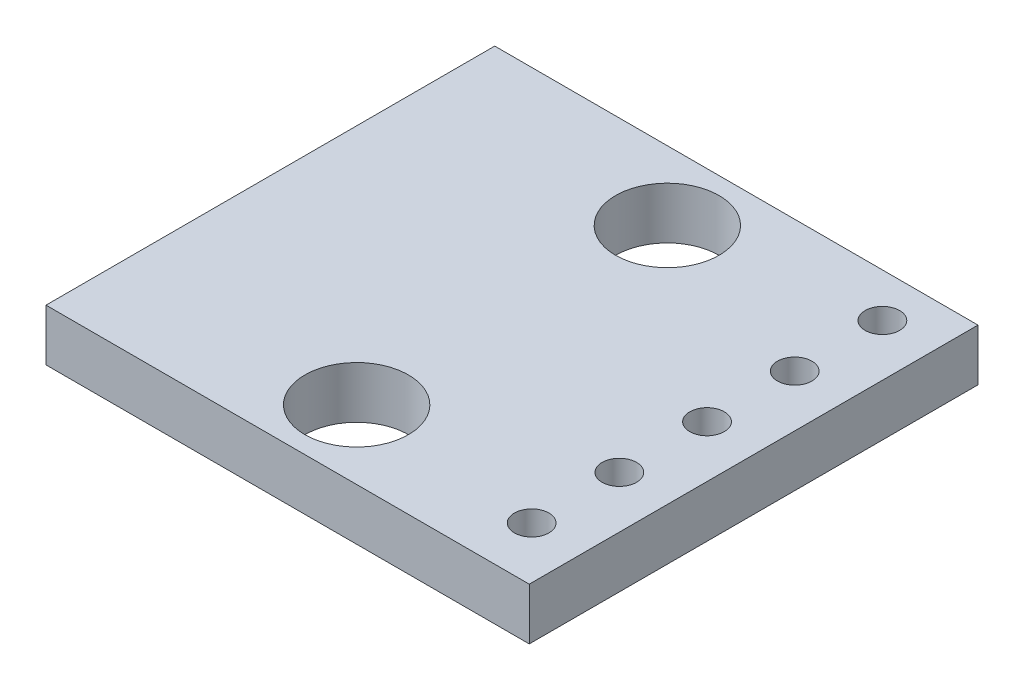
ISO-10303-21;
HEADER;
FILE_DESCRIPTION(('STEP AP214'),'2;1');
FILE_NAME('part.step','',(''),(''),'','','');
FILE_SCHEMA(('AUTOMOTIVE_DESIGN { 1 0 10303 214 1 1 1 1 }'));
ENDSEC;
DATA;
#1=APPLICATION_CONTEXT('core data for automotive mechanical design processes');
#2=APPLICATION_PROTOCOL_DEFINITION('international standard','automotive_design',2000,#1);
#3=PRODUCT_CONTEXT('',#1,'mechanical');
#4=PRODUCT('Part','Part','',(#3));
#5=PRODUCT_RELATED_PRODUCT_CATEGORY('part','',(#4));
#6=PRODUCT_DEFINITION_FORMATION('','',#4);
#7=PRODUCT_DEFINITION_CONTEXT('part definition',#1,'design');
#8=PRODUCT_DEFINITION('design','',#6,#7);
#9=PRODUCT_DEFINITION_SHAPE('','',#8);
#10=(LENGTH_UNIT() NAMED_UNIT(*) SI_UNIT(.MILLI.,.METRE.));
#11=(NAMED_UNIT(*) PLANE_ANGLE_UNIT() SI_UNIT($,.RADIAN.));
#12=(NAMED_UNIT(*) SI_UNIT($,.STERADIAN.) SOLID_ANGLE_UNIT());
#13=UNCERTAINTY_MEASURE_WITH_UNIT(LENGTH_MEASURE(1.E-05),#10,'distance_accuracy_value','');
#14=(GEOMETRIC_REPRESENTATION_CONTEXT(3) GLOBAL_UNCERTAINTY_ASSIGNED_CONTEXT((#13)) GLOBAL_UNIT_ASSIGNED_CONTEXT((#10,
#11,#12)) REPRESENTATION_CONTEXT('',''));
#15=CARTESIAN_POINT('',(0.,0.,0.));
#16=DIRECTION('',(0.,0.,1.));
#17=DIRECTION('',(1.,0.,0.));
#18=AXIS2_PLACEMENT_3D('',#15,#16,#17);
#19=CARTESIAN_POINT('',(7.,1.5,6.5));
#20=DIRECTION('',(-1.,0.,0.));
#21=DIRECTION('',(0.,0.,1.));
#22=AXIS2_PLACEMENT_3D('',#19,#20,#21);
#23=PLANE('',#22);
#24=DIRECTION('',(0.,0.,-1.));
#25=VECTOR('',#24,1.);
#26=CARTESIAN_POINT('',(7.,0.,6.5));
#27=LINE('',#26,#25);
#28=CARTESIAN_POINT('',(7.,0.,6.5));
#29=VERTEX_POINT('',#28);
#30=CARTESIAN_POINT('',(7.,0.,-6.5));
#31=VERTEX_POINT('',#30);
#32=EDGE_CURVE('E96',#29,#31,#27,.T.);
#33=ORIENTED_EDGE('',*,*,#32,.T.);
#34=DIRECTION('',(0.,-1.,0.));
#35=VECTOR('',#34,1.);
#36=CARTESIAN_POINT('',(7.,1.5,-6.5));
#37=LINE('',#36,#35);
#38=CARTESIAN_POINT('',(7.,1.5,-6.5));
#39=VERTEX_POINT('',#38);
#40=EDGE_CURVE('E11',#39,#31,#37,.T.);
#41=ORIENTED_EDGE('',*,*,#40,.F.);
#42=DIRECTION('',(0.,0.,-1.));
#43=VECTOR('',#42,1.);
#44=CARTESIAN_POINT('',(7.,1.5,6.5));
#45=LINE('',#44,#43);
#46=CARTESIAN_POINT('',(7.,1.5,6.5));
#47=VERTEX_POINT('',#46);
#48=EDGE_CURVE('E84',#47,#39,#45,.T.);
#49=ORIENTED_EDGE('',*,*,#48,.F.);
#50=DIRECTION('',(0.,-1.,0.));
#51=VECTOR('',#50,1.);
#52=CARTESIAN_POINT('',(7.,1.5,6.5));
#53=LINE('',#52,#51);
#54=EDGE_CURVE('E92',#47,#29,#53,.T.);
#55=ORIENTED_EDGE('',*,*,#54,.T.);
#56=EDGE_LOOP('',(#33,#41,#49,#55));
#57=FACE_BOUND('',#56,.T.);
#58=ADVANCED_FACE('F33',(#57),#23,.F.);
#59=CARTESIAN_POINT('',(-7.,1.5,-6.5));
#60=DIRECTION('',(0.,0.,1.));
#61=DIRECTION('',(1.,0.,0.));
#62=AXIS2_PLACEMENT_3D('',#59,#60,#61);
#63=PLANE('',#62);
#64=DIRECTION('',(-1.,0.,0.));
#65=VECTOR('',#64,1.);
#66=CARTESIAN_POINT('',(-7.,0.,-6.5));
#67=LINE('',#66,#65);
#68=CARTESIAN_POINT('',(-7.,0.,-6.5));
#69=VERTEX_POINT('',#68);
#70=EDGE_CURVE('E88',#31,#69,#67,.T.);
#71=ORIENTED_EDGE('',*,*,#70,.T.);
#72=DIRECTION('',(0.,-1.,0.));
#73=VECTOR('',#72,1.);
#74=CARTESIAN_POINT('',(-7.,1.5,-6.5));
#75=LINE('',#74,#73);
#76=CARTESIAN_POINT('',(-7.,1.5,-6.5));
#77=VERTEX_POINT('',#76);
#78=EDGE_CURVE('E41',#77,#69,#75,.T.);
#79=ORIENTED_EDGE('',*,*,#78,.F.);
#80=DIRECTION('',(-1.,0.,0.));
#81=VECTOR('',#80,1.);
#82=CARTESIAN_POINT('',(-7.,1.5,-6.5));
#83=LINE('',#82,#81);
#84=EDGE_CURVE('E79',#39,#77,#83,.T.);
#85=ORIENTED_EDGE('',*,*,#84,.F.);
#86=ORIENTED_EDGE('',*,*,#40,.T.);
#87=EDGE_LOOP('',(#71,#79,#85,#86));
#88=FACE_BOUND('',#87,.T.);
#89=ADVANCED_FACE('F87',(#88),#63,.F.);
#90=CARTESIAN_POINT('',(-7.,1.5,6.5));
#91=DIRECTION('',(1.,0.,0.));
#92=DIRECTION('',(0.,0.,-1.));
#93=AXIS2_PLACEMENT_3D('',#90,#91,#92);
#94=PLANE('',#93);
#95=DIRECTION('',(0.,0.,1.));
#96=VECTOR('',#95,1.);
#97=CARTESIAN_POINT('',(-7.,0.,6.5));
#98=LINE('',#97,#96);
#99=CARTESIAN_POINT('',(-7.,0.,6.5));
#100=VERTEX_POINT('',#99);
#101=EDGE_CURVE('E66',#69,#100,#98,.T.);
#102=ORIENTED_EDGE('',*,*,#101,.T.);
#103=DIRECTION('',(0.,-1.,0.));
#104=VECTOR('',#103,1.);
#105=CARTESIAN_POINT('',(-7.,1.5,6.5));
#106=LINE('',#105,#104);
#107=CARTESIAN_POINT('',(-7.,1.5,6.5));
#108=VERTEX_POINT('',#107);
#109=EDGE_CURVE('E89',#108,#100,#106,.T.);
#110=ORIENTED_EDGE('',*,*,#109,.F.);
#111=DIRECTION('',(0.,0.,1.));
#112=VECTOR('',#111,1.);
#113=CARTESIAN_POINT('',(-7.,1.5,6.5));
#114=LINE('',#113,#112);
#115=EDGE_CURVE('E82',#77,#108,#114,.T.);
#116=ORIENTED_EDGE('',*,*,#115,.F.);
#117=ORIENTED_EDGE('',*,*,#78,.T.);
#118=EDGE_LOOP('',(#102,#110,#116,#117));
#119=FACE_BOUND('',#118,.T.);
#120=ADVANCED_FACE('F90',(#119),#94,.F.);
#121=CARTESIAN_POINT('',(-7.,1.5,6.5));
#122=DIRECTION('',(0.,0.,-1.));
#123=DIRECTION('',(-1.,0.,0.));
#124=AXIS2_PLACEMENT_3D('',#121,#122,#123);
#125=PLANE('',#124);
#126=DIRECTION('',(1.,0.,0.));
#127=VECTOR('',#126,1.);
#128=CARTESIAN_POINT('',(-7.,0.,6.5));
#129=LINE('',#128,#127);
#130=EDGE_CURVE('E72',#100,#29,#129,.T.);
#131=ORIENTED_EDGE('',*,*,#130,.T.);
#132=ORIENTED_EDGE('',*,*,#54,.F.);
#133=DIRECTION('',(1.,0.,0.));
#134=VECTOR('',#133,1.);
#135=CARTESIAN_POINT('',(-7.,1.5,6.5));
#136=LINE('',#135,#134);
#137=EDGE_CURVE('E49',#108,#47,#136,.T.);
#138=ORIENTED_EDGE('',*,*,#137,.F.);
#139=ORIENTED_EDGE('',*,*,#109,.T.);
#140=EDGE_LOOP('',(#131,#132,#138,#139));
#141=FACE_BOUND('',#140,.T.);
#142=ADVANCED_FACE('F104',(#141),#125,.F.);
#143=CARTESIAN_POINT('',(0.,1.5,0.));
#144=DIRECTION('',(0.,-1.,0.));
#145=DIRECTION('',(0.,0.,-1.));
#146=AXIS2_PLACEMENT_3D('',#143,#144,#145);
#147=PLANE('',#146);
#148=CARTESIAN_POINT('',(5.49999999999997,1.5,-5.22999999999957));
#149=DIRECTION('',(0.,1.,0.));
#150=DIRECTION('',(0.,0.,1.));
#151=AXIS2_PLACEMENT_3D('',#148,#149,#150);
#152=CIRCLE('',#151,0.5);
#153=CARTESIAN_POINT('',(5.49999999999997,1.5,-4.72999999999957));
#154=VERTEX_POINT('',#153);
#155=EDGE_CURVE('E116',#154,#154,#152,.T.);
#156=ORIENTED_EDGE('',*,*,#155,.F.);
#157=EDGE_LOOP('',(#156));
#158=FACE_BOUND('',#157,.T.);
#159=CARTESIAN_POINT('',(5.49999999999997,1.5,-2.68999999999968));
#160=DIRECTION('',(0.,1.,0.));
#161=DIRECTION('',(0.,0.,1.));
#162=AXIS2_PLACEMENT_3D('',#159,#160,#161);
#163=CIRCLE('',#162,0.5);
#164=CARTESIAN_POINT('',(5.49999999999997,1.5,-2.18999999999968));
#165=VERTEX_POINT('',#164);
#166=EDGE_CURVE('E122',#165,#165,#163,.T.);
#167=ORIENTED_EDGE('',*,*,#166,.F.);
#168=EDGE_LOOP('',(#167));
#169=FACE_BOUND('',#168,.T.);
#170=CARTESIAN_POINT('',(5.49999999999998,1.5,-0.149999999999787));
#171=DIRECTION('',(0.,1.,0.));
#172=DIRECTION('',(0.,0.,1.));
#173=AXIS2_PLACEMENT_3D('',#170,#171,#172);
#174=CIRCLE('',#173,0.5);
#175=CARTESIAN_POINT('',(5.49999999999998,1.5,0.350000000000213));
#176=VERTEX_POINT('',#175);
#177=EDGE_CURVE('E128',#176,#176,#174,.T.);
#178=ORIENTED_EDGE('',*,*,#177,.F.);
#179=EDGE_LOOP('',(#178));
#180=FACE_BOUND('',#179,.T.);
#181=CARTESIAN_POINT('',(5.49999999999999,1.5,2.39000000000011));
#182=DIRECTION('',(0.,1.,0.));
#183=DIRECTION('',(0.,0.,1.));
#184=AXIS2_PLACEMENT_3D('',#181,#182,#183);
#185=CIRCLE('',#184,0.5);
#186=CARTESIAN_POINT('',(5.49999999999999,1.5,2.89000000000011));
#187=VERTEX_POINT('',#186);
#188=EDGE_CURVE('E134',#187,#187,#185,.T.);
#189=ORIENTED_EDGE('',*,*,#188,.F.);
#190=EDGE_LOOP('',(#189));
#191=FACE_BOUND('',#190,.T.);
#192=CARTESIAN_POINT('',(5.5,1.5,4.93));
#193=DIRECTION('',(0.,1.,0.));
#194=DIRECTION('',(0.,0.,1.));
#195=AXIS2_PLACEMENT_3D('',#192,#193,#194);
#196=CIRCLE('',#195,0.5);
#197=CARTESIAN_POINT('',(5.5,1.5,5.43));
#198=VERTEX_POINT('',#197);
#199=EDGE_CURVE('E140',#198,#198,#196,.T.);
#200=ORIENTED_EDGE('',*,*,#199,.F.);
#201=EDGE_LOOP('',(#200));
#202=FACE_BOUND('',#201,.T.);
#203=CARTESIAN_POINT('',(0.,1.5,4.5));
#204=DIRECTION('',(0.,1.,0.));
#205=DIRECTION('',(0.,0.,1.));
#206=AXIS2_PLACEMENT_3D('',#203,#204,#205);
#207=CIRCLE('',#206,1.5);
#208=CARTESIAN_POINT('',(0.,1.5,6.));
#209=VERTEX_POINT('',#208);
#210=EDGE_CURVE('E146',#209,#209,#207,.T.);
#211=ORIENTED_EDGE('',*,*,#210,.F.);
#212=EDGE_LOOP('',(#211));
#213=FACE_BOUND('',#212,.T.);
#214=CARTESIAN_POINT('',(0.,1.5,-4.5));
#215=DIRECTION('',(0.,1.,0.));
#216=DIRECTION('',(0.,0.,1.));
#217=AXIS2_PLACEMENT_3D('',#214,#215,#216);
#218=CIRCLE('',#217,1.5);
#219=CARTESIAN_POINT('',(0.,1.5,-3.));
#220=VERTEX_POINT('',#219);
#221=EDGE_CURVE('E110',#220,#220,#218,.T.);
#222=ORIENTED_EDGE('',*,*,#221,.F.);
#223=EDGE_LOOP('',(#222));
#224=FACE_BOUND('',#223,.T.);
#225=ORIENTED_EDGE('',*,*,#48,.T.);
#226=ORIENTED_EDGE('',*,*,#84,.T.);
#227=ORIENTED_EDGE('',*,*,#115,.T.);
#228=ORIENTED_EDGE('',*,*,#137,.T.);
#229=EDGE_LOOP('',(#225,#226,#227,#228));
#230=FACE_BOUND('',#229,.T.);
#231=ADVANCED_FACE('F80',(#158,#169,#180,#191,#202,#213,#224,#230),#147,.F.);
#232=CARTESIAN_POINT('',(0.,0.,0.));
#233=DIRECTION('',(0.,-1.,0.));
#234=DIRECTION('',(0.,0.,-1.));
#235=AXIS2_PLACEMENT_3D('',#232,#233,#234);
#236=PLANE('',#235);
#237=CARTESIAN_POINT('',(5.49999999999997,0.,-5.22999999999957));
#238=DIRECTION('',(0.,1.,0.));
#239=DIRECTION('',(0.,0.,1.));
#240=AXIS2_PLACEMENT_3D('',#237,#238,#239);
#241=CIRCLE('',#240,0.5);
#242=CARTESIAN_POINT('',(5.49999999999997,0.,-4.72999999999957));
#243=VERTEX_POINT('',#242);
#244=EDGE_CURVE('E119',#243,#243,#241,.T.);
#245=ORIENTED_EDGE('',*,*,#244,.T.);
#246=EDGE_LOOP('',(#245));
#247=FACE_BOUND('',#246,.T.);
#248=CARTESIAN_POINT('',(5.49999999999997,0.,-2.68999999999968));
#249=DIRECTION('',(0.,1.,0.));
#250=DIRECTION('',(0.,0.,1.));
#251=AXIS2_PLACEMENT_3D('',#248,#249,#250);
#252=CIRCLE('',#251,0.5);
#253=CARTESIAN_POINT('',(5.49999999999997,0.,-2.18999999999968));
#254=VERTEX_POINT('',#253);
#255=EDGE_CURVE('E125',#254,#254,#252,.T.);
#256=ORIENTED_EDGE('',*,*,#255,.T.);
#257=EDGE_LOOP('',(#256));
#258=FACE_BOUND('',#257,.T.);
#259=CARTESIAN_POINT('',(5.49999999999998,0.,-0.149999999999787));
#260=DIRECTION('',(0.,1.,0.));
#261=DIRECTION('',(0.,0.,1.));
#262=AXIS2_PLACEMENT_3D('',#259,#260,#261);
#263=CIRCLE('',#262,0.5);
#264=CARTESIAN_POINT('',(5.49999999999998,0.,0.350000000000213));
#265=VERTEX_POINT('',#264);
#266=EDGE_CURVE('E131',#265,#265,#263,.T.);
#267=ORIENTED_EDGE('',*,*,#266,.T.);
#268=EDGE_LOOP('',(#267));
#269=FACE_BOUND('',#268,.T.);
#270=CARTESIAN_POINT('',(5.49999999999999,0.,2.39000000000011));
#271=DIRECTION('',(0.,1.,0.));
#272=DIRECTION('',(0.,0.,1.));
#273=AXIS2_PLACEMENT_3D('',#270,#271,#272);
#274=CIRCLE('',#273,0.5);
#275=CARTESIAN_POINT('',(5.49999999999999,0.,2.89000000000011));
#276=VERTEX_POINT('',#275);
#277=EDGE_CURVE('E137',#276,#276,#274,.T.);
#278=ORIENTED_EDGE('',*,*,#277,.T.);
#279=EDGE_LOOP('',(#278));
#280=FACE_BOUND('',#279,.T.);
#281=CARTESIAN_POINT('',(5.5,0.,4.93));
#282=DIRECTION('',(0.,1.,0.));
#283=DIRECTION('',(0.,0.,1.));
#284=AXIS2_PLACEMENT_3D('',#281,#282,#283);
#285=CIRCLE('',#284,0.5);
#286=CARTESIAN_POINT('',(5.5,0.,5.43));
#287=VERTEX_POINT('',#286);
#288=EDGE_CURVE('E143',#287,#287,#285,.T.);
#289=ORIENTED_EDGE('',*,*,#288,.T.);
#290=EDGE_LOOP('',(#289));
#291=FACE_BOUND('',#290,.T.);
#292=CARTESIAN_POINT('',(0.,0.,4.5));
#293=DIRECTION('',(0.,1.,0.));
#294=DIRECTION('',(0.,0.,1.));
#295=AXIS2_PLACEMENT_3D('',#292,#293,#294);
#296=CIRCLE('',#295,1.5);
#297=CARTESIAN_POINT('',(0.,0.,6.));
#298=VERTEX_POINT('',#297);
#299=EDGE_CURVE('E113',#298,#298,#296,.T.);
#300=ORIENTED_EDGE('',*,*,#299,.T.);
#301=EDGE_LOOP('',(#300));
#302=FACE_BOUND('',#301,.T.);
#303=CARTESIAN_POINT('',(0.,0.,-4.5));
#304=DIRECTION('',(0.,1.,0.));
#305=DIRECTION('',(0.,0.,1.));
#306=AXIS2_PLACEMENT_3D('',#303,#304,#305);
#307=CIRCLE('',#306,1.5);
#308=CARTESIAN_POINT('',(0.,0.,-3.));
#309=VERTEX_POINT('',#308);
#310=EDGE_CURVE('E99',#309,#309,#307,.T.);
#311=ORIENTED_EDGE('',*,*,#310,.T.);
#312=EDGE_LOOP('',(#311));
#313=FACE_BOUND('',#312,.T.);
#314=ORIENTED_EDGE('',*,*,#32,.F.);
#315=ORIENTED_EDGE('',*,*,#130,.F.);
#316=ORIENTED_EDGE('',*,*,#101,.F.);
#317=ORIENTED_EDGE('',*,*,#70,.F.);
#318=EDGE_LOOP('',(#314,#315,#316,#317));
#319=FACE_BOUND('',#318,.T.);
#320=ADVANCED_FACE('F107',(#247,#258,#269,#280,#291,#302,#313,#319),#236,.T.);
#321=CARTESIAN_POINT('',(0.,0.,-4.5));
#322=DIRECTION('',(0.,1.,0.));
#323=DIRECTION('',(0.,0.,1.));
#324=AXIS2_PLACEMENT_3D('',#321,#322,#323);
#325=CYLINDRICAL_SURFACE('',#324,1.5);
#326=ORIENTED_EDGE('',*,*,#310,.F.);
#327=EDGE_LOOP('',(#326));
#328=FACE_BOUND('',#327,.T.);
#329=ORIENTED_EDGE('',*,*,#221,.T.);
#330=EDGE_LOOP('',(#329));
#331=FACE_BOUND('',#330,.T.);
#332=ADVANCED_FACE('F158',(#328,#331),#325,.F.);
#333=CARTESIAN_POINT('',(0.,0.,4.5));
#334=DIRECTION('',(0.,1.,0.));
#335=DIRECTION('',(0.,0.,1.));
#336=AXIS2_PLACEMENT_3D('',#333,#334,#335);
#337=CYLINDRICAL_SURFACE('',#336,1.5);
#338=ORIENTED_EDGE('',*,*,#299,.F.);
#339=EDGE_LOOP('',(#338));
#340=FACE_BOUND('',#339,.T.);
#341=ORIENTED_EDGE('',*,*,#210,.T.);
#342=EDGE_LOOP('',(#341));
#343=FACE_BOUND('',#342,.T.);
#344=ADVANCED_FACE('F154',(#340,#343),#337,.F.);
#345=CARTESIAN_POINT('',(5.5,0.,4.93));
#346=DIRECTION('',(0.,1.,0.));
#347=DIRECTION('',(0.,0.,1.));
#348=AXIS2_PLACEMENT_3D('',#345,#346,#347);
#349=CYLINDRICAL_SURFACE('',#348,0.5);
#350=ORIENTED_EDGE('',*,*,#288,.F.);
#351=EDGE_LOOP('',(#350));
#352=FACE_BOUND('',#351,.T.);
#353=ORIENTED_EDGE('',*,*,#199,.T.);
#354=EDGE_LOOP('',(#353));
#355=FACE_BOUND('',#354,.T.);
#356=ADVANCED_FACE('F157',(#352,#355),#349,.F.);
#357=CARTESIAN_POINT('',(5.49999999999999,0.,2.39000000000011));
#358=DIRECTION('',(0.,1.,0.));
#359=DIRECTION('',(0.,0.,1.));
#360=AXIS2_PLACEMENT_3D('',#357,#358,#359);
#361=CYLINDRICAL_SURFACE('',#360,0.5);
#362=ORIENTED_EDGE('',*,*,#277,.F.);
#363=EDGE_LOOP('',(#362));
#364=FACE_BOUND('',#363,.T.);
#365=ORIENTED_EDGE('',*,*,#188,.T.);
#366=EDGE_LOOP('',(#365));
#367=FACE_BOUND('',#366,.T.);
#368=ADVANCED_FACE('F219',(#364,#367),#361,.F.);
#369=CARTESIAN_POINT('',(5.49999999999998,0.,-0.149999999999787));
#370=DIRECTION('',(0.,1.,0.));
#371=DIRECTION('',(0.,0.,1.));
#372=AXIS2_PLACEMENT_3D('',#369,#370,#371);
#373=CYLINDRICAL_SURFACE('',#372,0.5);
#374=ORIENTED_EDGE('',*,*,#266,.F.);
#375=EDGE_LOOP('',(#374));
#376=FACE_BOUND('',#375,.T.);
#377=ORIENTED_EDGE('',*,*,#177,.T.);
#378=EDGE_LOOP('',(#377));
#379=FACE_BOUND('',#378,.T.);
#380=ADVANCED_FACE('F229',(#376,#379),#373,.F.);
#381=CARTESIAN_POINT('',(5.49999999999997,0.,-2.68999999999968));
#382=DIRECTION('',(0.,1.,0.));
#383=DIRECTION('',(0.,0.,1.));
#384=AXIS2_PLACEMENT_3D('',#381,#382,#383);
#385=CYLINDRICAL_SURFACE('',#384,0.5);
#386=ORIENTED_EDGE('',*,*,#255,.F.);
#387=EDGE_LOOP('',(#386));
#388=FACE_BOUND('',#387,.T.);
#389=ORIENTED_EDGE('',*,*,#166,.T.);
#390=EDGE_LOOP('',(#389));
#391=FACE_BOUND('',#390,.T.);
#392=ADVANCED_FACE('F239',(#388,#391),#385,.F.);
#393=CARTESIAN_POINT('',(5.49999999999997,0.,-5.22999999999957));
#394=DIRECTION('',(0.,1.,0.));
#395=DIRECTION('',(0.,0.,1.));
#396=AXIS2_PLACEMENT_3D('',#393,#394,#395);
#397=CYLINDRICAL_SURFACE('',#396,0.5);
#398=ORIENTED_EDGE('',*,*,#244,.F.);
#399=EDGE_LOOP('',(#398));
#400=FACE_BOUND('',#399,.T.);
#401=ORIENTED_EDGE('',*,*,#155,.T.);
#402=EDGE_LOOP('',(#401));
#403=FACE_BOUND('',#402,.T.);
#404=ADVANCED_FACE('F249',(#400,#403),#397,.F.);
#405=CLOSED_SHELL('',(#58,#89,#120,#142,#231,#320,#332,#344,#356,#368,#380,#392,#404));
#406=MANIFOLD_SOLID_BREP('B2',#405);
#407=ADVANCED_BREP_SHAPE_REPRESENTATION('',(#18,#406),#14);
#408=SHAPE_DEFINITION_REPRESENTATION(#9,#407);
ENDSEC;
END-ISO-10303-21;
